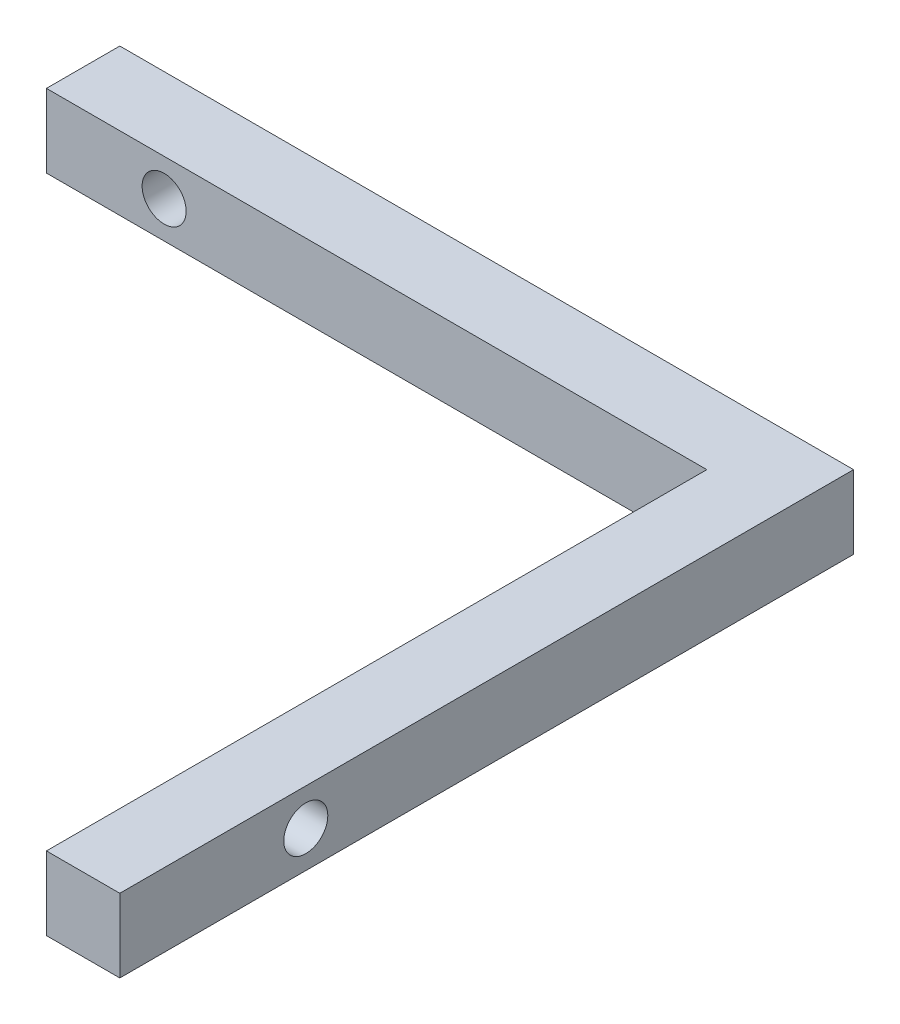
ISO-10303-21;
HEADER;
FILE_DESCRIPTION(('STEP AP214'),'2;1');
FILE_NAME('part.step','',(''),(''),'','','');
FILE_SCHEMA(('AUTOMOTIVE_DESIGN { 1 0 10303 214 1 1 1 1 }'));
ENDSEC;
DATA;
#1=APPLICATION_CONTEXT('core data for automotive mechanical design processes');
#2=APPLICATION_PROTOCOL_DEFINITION('international standard','automotive_design',2000,#1);
#3=PRODUCT_CONTEXT('',#1,'mechanical');
#4=PRODUCT('Part','Part','',(#3));
#5=PRODUCT_RELATED_PRODUCT_CATEGORY('part','',(#4));
#6=PRODUCT_DEFINITION_FORMATION('','',#4);
#7=PRODUCT_DEFINITION_CONTEXT('part definition',#1,'design');
#8=PRODUCT_DEFINITION('design','',#6,#7);
#9=PRODUCT_DEFINITION_SHAPE('','',#8);
#10=(LENGTH_UNIT() NAMED_UNIT(*) SI_UNIT(.MILLI.,.METRE.));
#11=(NAMED_UNIT(*) PLANE_ANGLE_UNIT() SI_UNIT($,.RADIAN.));
#12=(NAMED_UNIT(*) SI_UNIT($,.STERADIAN.) SOLID_ANGLE_UNIT());
#13=UNCERTAINTY_MEASURE_WITH_UNIT(LENGTH_MEASURE(1.E-05),#10,'distance_accuracy_value','');
#14=(GEOMETRIC_REPRESENTATION_CONTEXT(3) GLOBAL_UNCERTAINTY_ASSIGNED_CONTEXT((#13)) GLOBAL_UNIT_ASSIGNED_CONTEXT((#10,
#11,#12)) REPRESENTATION_CONTEXT('',''));
#15=CARTESIAN_POINT('',(0.,0.,0.));
#16=DIRECTION('',(0.,0.,1.));
#17=DIRECTION('',(1.,0.,0.));
#18=AXIS2_PLACEMENT_3D('',#15,#16,#17);
#19=CARTESIAN_POINT('',(0.,10.,5.));
#20=DIRECTION('',(0.,0.,1.));
#21=DIRECTION('',(1.,0.,0.));
#22=AXIS2_PLACEMENT_3D('',#19,#20,#21);
#23=PLANE('',#22);
#24=CARTESIAN_POINT('',(-33.959177931078,5.,4.99999999999999));
#25=DIRECTION('',(0.,0.,1.));
#26=DIRECTION('',(1.,0.,0.));
#27=AXIS2_PLACEMENT_3D('',#24,#25,#26);
#28=CIRCLE('',#27,3.);
#29=CARTESIAN_POINT('',(-30.959177931078,5.,4.99999999999999));
#30=VERTEX_POINT('',#29);
#31=EDGE_CURVE('E121',#30,#30,#28,.T.);
#32=ORIENTED_EDGE('',*,*,#31,.F.);
#33=EDGE_LOOP('',(#32));
#34=FACE_BOUND('',#33,.T.);
#35=DIRECTION('',(-1.,0.,0.));
#36=VECTOR('',#35,1.);
#37=CARTESIAN_POINT('',(0.,0.,5.));
#38=LINE('',#37,#36);
#39=CARTESIAN_POINT('',(40.,0.,4.99999999999999));
#40=VERTEX_POINT('',#39);
#41=CARTESIAN_POINT('',(-50.,0.,5.));
#42=VERTEX_POINT('',#41);
#43=EDGE_CURVE('E118',#40,#42,#38,.T.);
#44=ORIENTED_EDGE('',*,*,#43,.F.);
#45=DIRECTION('',(0.,-1.,0.));
#46=VECTOR('',#45,1.);
#47=CARTESIAN_POINT('',(40.,10.,4.99999999999999));
#48=LINE('',#47,#46);
#49=CARTESIAN_POINT('',(40.,10.,4.99999999999999));
#50=VERTEX_POINT('',#49);
#51=EDGE_CURVE('E11',#50,#40,#48,.T.);
#52=ORIENTED_EDGE('',*,*,#51,.F.);
#53=DIRECTION('',(-1.,0.,0.));
#54=VECTOR('',#53,1.);
#55=CARTESIAN_POINT('',(0.,10.,5.));
#56=LINE('',#55,#54);
#57=CARTESIAN_POINT('',(-50.,10.,5.));
#58=VERTEX_POINT('',#57);
#59=EDGE_CURVE('E133',#50,#58,#56,.T.);
#60=ORIENTED_EDGE('',*,*,#59,.T.);
#61=DIRECTION('',(0.,-1.,0.));
#62=VECTOR('',#61,1.);
#63=CARTESIAN_POINT('',(-50.,10.,5.));
#64=LINE('',#63,#62);
#65=EDGE_CURVE('E51',#58,#42,#64,.T.);
#66=ORIENTED_EDGE('',*,*,#65,.T.);
#67=EDGE_LOOP('',(#44,#52,#60,#66));
#68=FACE_BOUND('',#67,.T.);
#69=ADVANCED_FACE('F35',(#34,#68),#23,.T.);
#70=CARTESIAN_POINT('',(40.,10.,0.));
#71=DIRECTION('',(1.,0.,0.));
#72=DIRECTION('',(0.,0.,-1.));
#73=AXIS2_PLACEMENT_3D('',#70,#71,#72);
#74=PLANE('',#73);
#75=CARTESIAN_POINT('',(40.,5.,69.6525234827896));
#76=DIRECTION('',(1.,0.,0.));
#77=DIRECTION('',(0.,0.,-1.));
#78=AXIS2_PLACEMENT_3D('',#75,#76,#77);
#79=CIRCLE('',#78,3.00000000000001);
#80=CARTESIAN_POINT('',(40.,5.,66.6525234827896));
#81=VERTEX_POINT('',#80);
#82=EDGE_CURVE('E168',#81,#81,#79,.T.);
#83=ORIENTED_EDGE('',*,*,#82,.T.);
#84=EDGE_LOOP('',(#83));
#85=FACE_BOUND('',#84,.T.);
#86=DIRECTION('',(0.,0.,1.));
#87=VECTOR('',#86,1.);
#88=CARTESIAN_POINT('',(40.,0.,0.));
#89=LINE('',#88,#87);
#90=CARTESIAN_POINT('',(40.,0.,95.));
#91=VERTEX_POINT('',#90);
#92=EDGE_CURVE('E120',#40,#91,#89,.T.);
#93=ORIENTED_EDGE('',*,*,#92,.T.);
#94=DIRECTION('',(0.,-1.,0.));
#95=VECTOR('',#94,1.);
#96=CARTESIAN_POINT('',(40.,10.,95.));
#97=LINE('',#96,#95);
#98=CARTESIAN_POINT('',(40.,10.,95.));
#99=VERTEX_POINT('',#98);
#100=EDGE_CURVE('E43',#99,#91,#97,.T.);
#101=ORIENTED_EDGE('',*,*,#100,.F.);
#102=DIRECTION('',(0.,0.,1.));
#103=VECTOR('',#102,1.);
#104=CARTESIAN_POINT('',(40.,10.,0.));
#105=LINE('',#104,#103);
#106=EDGE_CURVE('E113',#50,#99,#105,.T.);
#107=ORIENTED_EDGE('',*,*,#106,.F.);
#108=ORIENTED_EDGE('',*,*,#51,.T.);
#109=EDGE_LOOP('',(#93,#101,#107,#108));
#110=FACE_BOUND('',#109,.T.);
#111=ADVANCED_FACE('F142',(#85,#110),#74,.F.);
#112=CARTESIAN_POINT('',(2.63677968348475E-13,10.,95.0000000000002));
#113=DIRECTION('',(0.,0.,1.));
#114=DIRECTION('',(1.,0.,0.));
#115=AXIS2_PLACEMENT_3D('',#112,#113,#114);
#116=PLANE('',#115);
#117=DIRECTION('',(-1.,0.,0.));
#118=VECTOR('',#117,1.);
#119=CARTESIAN_POINT('',(2.63677968348475E-13,0.,95.0000000000002));
#120=LINE('',#119,#118);
#121=CARTESIAN_POINT('',(50.,0.,95.));
#122=VERTEX_POINT('',#121);
#123=EDGE_CURVE('E124',#122,#91,#120,.T.);
#124=ORIENTED_EDGE('',*,*,#123,.F.);
#125=DIRECTION('',(0.,-1.,0.));
#126=VECTOR('',#125,1.);
#127=CARTESIAN_POINT('',(50.,10.,95.));
#128=LINE('',#127,#126);
#129=CARTESIAN_POINT('',(50.,10.,95.));
#130=VERTEX_POINT('',#129);
#131=EDGE_CURVE('E99',#130,#122,#128,.T.);
#132=ORIENTED_EDGE('',*,*,#131,.F.);
#133=DIRECTION('',(-1.,0.,0.));
#134=VECTOR('',#133,1.);
#135=CARTESIAN_POINT('',(2.63677968348475E-13,10.,95.0000000000002));
#136=LINE('',#135,#134);
#137=EDGE_CURVE('E111',#130,#99,#136,.T.);
#138=ORIENTED_EDGE('',*,*,#137,.T.);
#139=ORIENTED_EDGE('',*,*,#100,.T.);
#140=EDGE_LOOP('',(#124,#132,#138,#139));
#141=FACE_BOUND('',#140,.T.);
#142=ADVANCED_FACE('F139',(#141),#116,.T.);
#143=CARTESIAN_POINT('',(50.,10.,0.));
#144=DIRECTION('',(1.,0.,0.));
#145=DIRECTION('',(0.,0.,-1.));
#146=AXIS2_PLACEMENT_3D('',#143,#144,#145);
#147=PLANE('',#146);
#148=CARTESIAN_POINT('',(50.,5.,69.6525234827896));
#149=DIRECTION('',(1.,0.,0.));
#150=DIRECTION('',(0.,0.,-1.));
#151=AXIS2_PLACEMENT_3D('',#148,#149,#150);
#152=CIRCLE('',#151,3.00000000000001);
#153=CARTESIAN_POINT('',(50.,5.,66.6525234827896));
#154=VERTEX_POINT('',#153);
#155=EDGE_CURVE('E174',#154,#154,#152,.T.);
#156=ORIENTED_EDGE('',*,*,#155,.F.);
#157=EDGE_LOOP('',(#156));
#158=FACE_BOUND('',#157,.T.);
#159=DIRECTION('',(0.,0.,1.));
#160=VECTOR('',#159,1.);
#161=CARTESIAN_POINT('',(50.,0.,0.));
#162=LINE('',#161,#160);
#163=CARTESIAN_POINT('',(50.,0.,-5.));
#164=VERTEX_POINT('',#163);
#165=EDGE_CURVE('E96',#164,#122,#162,.T.);
#166=ORIENTED_EDGE('',*,*,#165,.F.);
#167=DIRECTION('',(0.,-1.,0.));
#168=VECTOR('',#167,1.);
#169=CARTESIAN_POINT('',(50.,10.,-5.));
#170=LINE('',#169,#168);
#171=CARTESIAN_POINT('',(50.,10.,-5.));
#172=VERTEX_POINT('',#171);
#173=EDGE_CURVE('E90',#172,#164,#170,.T.);
#174=ORIENTED_EDGE('',*,*,#173,.F.);
#175=DIRECTION('',(0.,0.,1.));
#176=VECTOR('',#175,1.);
#177=CARTESIAN_POINT('',(50.,10.,0.));
#178=LINE('',#177,#176);
#179=EDGE_CURVE('E94',#172,#130,#178,.T.);
#180=ORIENTED_EDGE('',*,*,#179,.T.);
#181=ORIENTED_EDGE('',*,*,#131,.T.);
#182=EDGE_LOOP('',(#166,#174,#180,#181));
#183=FACE_BOUND('',#182,.T.);
#184=ADVANCED_FACE('F92',(#158,#183),#147,.T.);
#185=CARTESIAN_POINT('',(0.,10.,-5.));
#186=DIRECTION('',(0.,0.,1.));
#187=DIRECTION('',(1.,0.,0.));
#188=AXIS2_PLACEMENT_3D('',#185,#186,#187);
#189=PLANE('',#188);
#190=CARTESIAN_POINT('',(-33.959177931078,5.,-5.));
#191=DIRECTION('',(0.,0.,-1.));
#192=DIRECTION('',(-1.,0.,0.));
#193=AXIS2_PLACEMENT_3D('',#190,#191,#192);
#194=CIRCLE('',#193,3.);
#195=CARTESIAN_POINT('',(-36.959177931078,5.,-5.));
#196=VERTEX_POINT('',#195);
#197=EDGE_CURVE('E165',#196,#196,#194,.T.);
#198=ORIENTED_EDGE('',*,*,#197,.F.);
#199=EDGE_LOOP('',(#198));
#200=FACE_BOUND('',#199,.T.);
#201=DIRECTION('',(-1.,0.,0.));
#202=VECTOR('',#201,1.);
#203=CARTESIAN_POINT('',(0.,0.,-5.));
#204=LINE('',#203,#202);
#205=CARTESIAN_POINT('',(-50.,0.,-5.));
#206=VERTEX_POINT('',#205);
#207=EDGE_CURVE('E128',#164,#206,#204,.T.);
#208=ORIENTED_EDGE('',*,*,#207,.T.);
#209=DIRECTION('',(0.,-1.,0.));
#210=VECTOR('',#209,1.);
#211=CARTESIAN_POINT('',(-50.,10.,-5.));
#212=LINE('',#211,#210);
#213=CARTESIAN_POINT('',(-50.,10.,-5.));
#214=VERTEX_POINT('',#213);
#215=EDGE_CURVE('E71',#214,#206,#212,.T.);
#216=ORIENTED_EDGE('',*,*,#215,.F.);
#217=DIRECTION('',(-1.,0.,0.));
#218=VECTOR('',#217,1.);
#219=CARTESIAN_POINT('',(0.,10.,-5.));
#220=LINE('',#219,#218);
#221=EDGE_CURVE('E101',#172,#214,#220,.T.);
#222=ORIENTED_EDGE('',*,*,#221,.F.);
#223=ORIENTED_EDGE('',*,*,#173,.T.);
#224=EDGE_LOOP('',(#208,#216,#222,#223));
#225=FACE_BOUND('',#224,.T.);
#226=ADVANCED_FACE('F102',(#200,#225),#189,.F.);
#227=CARTESIAN_POINT('',(-50.,10.,0.));
#228=DIRECTION('',(-1.,0.,0.));
#229=DIRECTION('',(0.,0.,1.));
#230=AXIS2_PLACEMENT_3D('',#227,#228,#229);
#231=PLANE('',#230);
#232=DIRECTION('',(0.,0.,-1.));
#233=VECTOR('',#232,1.);
#234=CARTESIAN_POINT('',(-50.,0.,0.));
#235=LINE('',#234,#233);
#236=EDGE_CURVE('E130',#42,#206,#235,.T.);
#237=ORIENTED_EDGE('',*,*,#236,.F.);
#238=ORIENTED_EDGE('',*,*,#65,.F.);
#239=DIRECTION('',(0.,0.,-1.));
#240=VECTOR('',#239,1.);
#241=CARTESIAN_POINT('',(-50.,10.,0.));
#242=LINE('',#241,#240);
#243=EDGE_CURVE('E105',#58,#214,#242,.T.);
#244=ORIENTED_EDGE('',*,*,#243,.T.);
#245=ORIENTED_EDGE('',*,*,#215,.T.);
#246=EDGE_LOOP('',(#237,#238,#244,#245));
#247=FACE_BOUND('',#246,.T.);
#248=ADVANCED_FACE('F145',(#247),#231,.T.);
#249=CARTESIAN_POINT('',(0.,10.,0.));
#250=DIRECTION('',(0.,1.,0.));
#251=DIRECTION('',(0.,0.,1.));
#252=AXIS2_PLACEMENT_3D('',#249,#250,#251);
#253=PLANE('',#252);
#254=ORIENTED_EDGE('',*,*,#59,.F.);
#255=ORIENTED_EDGE('',*,*,#106,.T.);
#256=ORIENTED_EDGE('',*,*,#137,.F.);
#257=ORIENTED_EDGE('',*,*,#179,.F.);
#258=ORIENTED_EDGE('',*,*,#221,.T.);
#259=ORIENTED_EDGE('',*,*,#243,.F.);
#260=EDGE_LOOP('',(#254,#255,#256,#257,#258,#259));
#261=FACE_BOUND('',#260,.T.);
#262=ADVANCED_FACE('F109',(#261),#253,.T.);
#263=CARTESIAN_POINT('',(0.,0.,0.));
#264=DIRECTION('',(0.,1.,0.));
#265=DIRECTION('',(0.,0.,1.));
#266=AXIS2_PLACEMENT_3D('',#263,#264,#265);
#267=PLANE('',#266);
#268=ORIENTED_EDGE('',*,*,#43,.T.);
#269=ORIENTED_EDGE('',*,*,#236,.T.);
#270=ORIENTED_EDGE('',*,*,#207,.F.);
#271=ORIENTED_EDGE('',*,*,#165,.T.);
#272=ORIENTED_EDGE('',*,*,#123,.T.);
#273=ORIENTED_EDGE('',*,*,#92,.F.);
#274=EDGE_LOOP('',(#268,#269,#270,#271,#272,#273));
#275=FACE_BOUND('',#274,.T.);
#276=ADVANCED_FACE('F144',(#275),#267,.F.);
#277=CARTESIAN_POINT('',(-33.959177931078,5.,95.));
#278=DIRECTION('',(0.,0.,-1.));
#279=DIRECTION('',(-1.,0.,0.));
#280=AXIS2_PLACEMENT_3D('',#277,#278,#279);
#281=CYLINDRICAL_SURFACE('',#280,3.);
#282=ORIENTED_EDGE('',*,*,#31,.T.);
#283=EDGE_LOOP('',(#282));
#284=FACE_BOUND('',#283,.T.);
#285=ORIENTED_EDGE('',*,*,#197,.T.);
#286=EDGE_LOOP('',(#285));
#287=FACE_BOUND('',#286,.T.);
#288=ADVANCED_FACE('F199',(#284,#287),#281,.F.);
#289=CARTESIAN_POINT('',(-50.,5.,69.6525234827897));
#290=DIRECTION('',(1.,0.,0.));
#291=DIRECTION('',(0.,0.,-1.));
#292=AXIS2_PLACEMENT_3D('',#289,#290,#291);
#293=CYLINDRICAL_SURFACE('',#292,3.00000000000001);
#294=ORIENTED_EDGE('',*,*,#155,.T.);
#295=EDGE_LOOP('',(#294));
#296=FACE_BOUND('',#295,.T.);
#297=ORIENTED_EDGE('',*,*,#82,.F.);
#298=EDGE_LOOP('',(#297));
#299=FACE_BOUND('',#298,.T.);
#300=ADVANCED_FACE('F178',(#296,#299),#293,.F.);
#301=CLOSED_SHELL('',(#69,#111,#142,#184,#226,#248,#262,#276,#288,#300));
#302=MANIFOLD_SOLID_BREP('B2',#301);
#303=ADVANCED_BREP_SHAPE_REPRESENTATION('',(#18,#302),#14);
#304=SHAPE_DEFINITION_REPRESENTATION(#9,#303);
ENDSEC;
END-ISO-10303-21;
